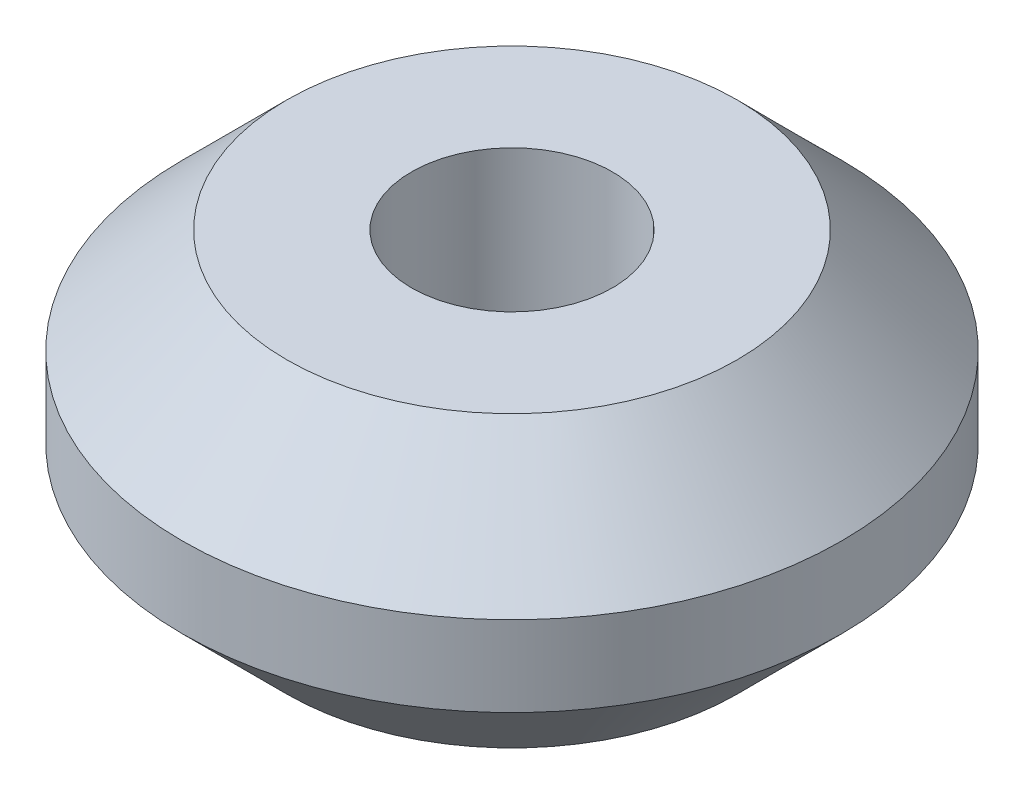
ISO-10303-21;
HEADER;
FILE_DESCRIPTION(('STEP AP214'),'2;1');
FILE_NAME('part.step','',(''),(''),'','','');
FILE_SCHEMA(('AUTOMOTIVE_DESIGN { 1 0 10303 214 1 1 1 1 }'));
ENDSEC;
DATA;
#1=APPLICATION_CONTEXT('core data for automotive mechanical design processes');
#2=APPLICATION_PROTOCOL_DEFINITION('international standard','automotive_design',2000,#1);
#3=PRODUCT_CONTEXT('',#1,'mechanical');
#4=PRODUCT('Part','Part','',(#3));
#5=PRODUCT_RELATED_PRODUCT_CATEGORY('part','',(#4));
#6=PRODUCT_DEFINITION_FORMATION('','',#4);
#7=PRODUCT_DEFINITION_CONTEXT('part definition',#1,'design');
#8=PRODUCT_DEFINITION('design','',#6,#7);
#9=PRODUCT_DEFINITION_SHAPE('','',#8);
#10=(LENGTH_UNIT() NAMED_UNIT(*) SI_UNIT(.MILLI.,.METRE.));
#11=(NAMED_UNIT(*) PLANE_ANGLE_UNIT() SI_UNIT($,.RADIAN.));
#12=(NAMED_UNIT(*) SI_UNIT($,.STERADIAN.) SOLID_ANGLE_UNIT());
#13=UNCERTAINTY_MEASURE_WITH_UNIT(LENGTH_MEASURE(1.E-05),#10,'distance_accuracy_value','');
#14=(GEOMETRIC_REPRESENTATION_CONTEXT(3) GLOBAL_UNCERTAINTY_ASSIGNED_CONTEXT((#13)) GLOBAL_UNIT_ASSIGNED_CONTEXT((#10,
#11,#12)) REPRESENTATION_CONTEXT('',''));
#15=CARTESIAN_POINT('',(0.,0.,0.));
#16=DIRECTION('',(0.,0.,1.));
#17=DIRECTION('',(1.,0.,0.));
#18=AXIS2_PLACEMENT_3D('',#15,#16,#17);
#19=CARTESIAN_POINT('',(0.,18.,0.));
#20=DIRECTION('',(0.,-1.,0.));
#21=DIRECTION('',(0.,0.,-1.));
#22=AXIS2_PLACEMENT_3D('',#19,#20,#21);
#23=CYLINDRICAL_SURFACE('',#22,20.5);
#24=CARTESIAN_POINT('',(0.,11.5,0.));
#25=DIRECTION('',(0.,1.,0.));
#26=DIRECTION('',(0.,0.,1.));
#27=AXIS2_PLACEMENT_3D('',#24,#25,#26);
#28=CIRCLE('',#27,20.5);
#29=CARTESIAN_POINT('',(0.,11.5,20.5));
#30=VERTEX_POINT('',#29);
#31=EDGE_CURVE('E47',#30,#30,#28,.F.);
#32=ORIENTED_EDGE('',*,*,#31,.T.);
#33=EDGE_LOOP('',(#32));
#34=FACE_BOUND('',#33,.T.);
#35=CARTESIAN_POINT('',(0.,6.5,0.));
#36=DIRECTION('',(0.,1.,0.));
#37=DIRECTION('',(0.,0.,1.));
#38=AXIS2_PLACEMENT_3D('',#35,#36,#37);
#39=CIRCLE('',#38,20.5);
#40=CARTESIAN_POINT('',(0.,6.5,20.5));
#41=VERTEX_POINT('',#40);
#42=EDGE_CURVE('E51',#41,#41,#39,.T.);
#43=ORIENTED_EDGE('',*,*,#42,.T.);
#44=EDGE_LOOP('',(#43));
#45=FACE_BOUND('',#44,.T.);
#46=ADVANCED_FACE('F39',(#34,#45),#23,.T.);
#47=CARTESIAN_POINT('',(0.,18.,0.));
#48=DIRECTION('',(0.,1.,0.));
#49=DIRECTION('',(0.,0.,1.));
#50=AXIS2_PLACEMENT_3D('',#47,#48,#49);
#51=PLANE('',#50);
#52=CARTESIAN_POINT('',(0.,18.,0.));
#53=DIRECTION('',(0.,1.,0.));
#54=DIRECTION('',(0.,0.,1.));
#55=AXIS2_PLACEMENT_3D('',#52,#53,#54);
#56=CIRCLE('',#55,6.25);
#57=CARTESIAN_POINT('',(0.,18.,6.25));
#58=VERTEX_POINT('',#57);
#59=EDGE_CURVE('E61',#58,#58,#56,.T.);
#60=ORIENTED_EDGE('',*,*,#59,.F.);
#61=EDGE_LOOP('',(#60));
#62=FACE_BOUND('',#61,.T.);
#63=CARTESIAN_POINT('',(0.,18.,0.));
#64=DIRECTION('',(0.,1.,0.));
#65=DIRECTION('',(0.,0.,1.));
#66=AXIS2_PLACEMENT_3D('',#63,#64,#65);
#67=CIRCLE('',#66,14.);
#68=CARTESIAN_POINT('',(0.,18.,14.));
#69=VERTEX_POINT('',#68);
#70=EDGE_CURVE('E55',#69,#69,#67,.T.);
#71=ORIENTED_EDGE('',*,*,#70,.T.);
#72=EDGE_LOOP('',(#71));
#73=FACE_BOUND('',#72,.T.);
#74=ADVANCED_FACE('F75',(#62,#73),#51,.T.);
#75=CARTESIAN_POINT('',(0.,0.,0.));
#76=DIRECTION('',(0.,1.,0.));
#77=DIRECTION('',(0.,0.,1.));
#78=AXIS2_PLACEMENT_3D('',#75,#76,#77);
#79=PLANE('',#78);
#80=CARTESIAN_POINT('',(0.,0.,0.));
#81=DIRECTION('',(0.,1.,0.));
#82=DIRECTION('',(0.,0.,1.));
#83=AXIS2_PLACEMENT_3D('',#80,#81,#82);
#84=CIRCLE('',#83,6.25);
#85=CARTESIAN_POINT('',(0.,0.,6.25));
#86=VERTEX_POINT('',#85);
#87=EDGE_CURVE('E60',#86,#86,#84,.T.);
#88=ORIENTED_EDGE('',*,*,#87,.T.);
#89=EDGE_LOOP('',(#88));
#90=FACE_BOUND('',#89,.T.);
#91=CARTESIAN_POINT('',(0.,0.,0.));
#92=DIRECTION('',(0.,1.,0.));
#93=DIRECTION('',(0.,0.,1.));
#94=AXIS2_PLACEMENT_3D('',#91,#92,#93);
#95=CIRCLE('',#94,14.);
#96=CARTESIAN_POINT('',(0.,0.,14.));
#97=VERTEX_POINT('',#96);
#98=EDGE_CURVE('E10',#97,#97,#95,.F.);
#99=ORIENTED_EDGE('',*,*,#98,.T.);
#100=EDGE_LOOP('',(#99));
#101=FACE_BOUND('',#100,.T.);
#102=ADVANCED_FACE('F67',(#90,#101),#79,.F.);
#103=CARTESIAN_POINT('',(0.,18.,0.));
#104=DIRECTION('',(0.,-1.,0.));
#105=DIRECTION('',(0.,0.,-1.));
#106=AXIS2_PLACEMENT_3D('',#103,#104,#105);
#107=CONICAL_SURFACE('',#106,14.,0.785398163397446);
#108=ORIENTED_EDGE('',*,*,#31,.F.);
#109=EDGE_LOOP('',(#108));
#110=FACE_BOUND('',#109,.T.);
#111=ORIENTED_EDGE('',*,*,#70,.F.);
#112=EDGE_LOOP('',(#111));
#113=FACE_BOUND('',#112,.T.);
#114=ADVANCED_FACE('F81',(#110,#113),#107,.T.);
#115=CARTESIAN_POINT('',(0.,6.5,0.));
#116=DIRECTION('',(0.,1.,0.));
#117=DIRECTION('',(0.,0.,1.));
#118=AXIS2_PLACEMENT_3D('',#115,#116,#117);
#119=CONICAL_SURFACE('',#118,20.5,0.785398163397449);
#120=CARTESIAN_POINT('',(0.,0.,14.));
#121=CARTESIAN_POINT('',(0.,0.0677083333333323,14.0677083333333));
#122=CARTESIAN_POINT('',(0.,0.135416666666666,14.1354166666666));
#123=CARTESIAN_POINT('',(0.,0.270833333333333,14.2708333333333));
#124=CARTESIAN_POINT('',(0.,0.338541666666666,14.3385416666667));
#125=CARTESIAN_POINT('',(0.,0.473958333333333,14.4739583333333));
#126=CARTESIAN_POINT('',(0.,0.541666666666666,14.5416666666667));
#127=CARTESIAN_POINT('',(0.,0.677083333333333,14.6770833333333));
#128=CARTESIAN_POINT('',(0.,0.744791666666666,14.7447916666667));
#129=CARTESIAN_POINT('',(0.,0.880208333333333,14.8802083333333));
#130=CARTESIAN_POINT('',(0.,0.947916666666667,14.9479166666667));
#131=CARTESIAN_POINT('',(0.,1.08333333333333,15.0833333333333));
#132=CARTESIAN_POINT('',(0.,1.15104166666667,15.1510416666667));
#133=CARTESIAN_POINT('',(0.,1.28645833333333,15.2864583333333));
#134=CARTESIAN_POINT('',(0.,1.35416666666667,15.3541666666667));
#135=CARTESIAN_POINT('',(0.,1.48958333333333,15.4895833333333));
#136=CARTESIAN_POINT('',(0.,1.55729166666667,15.5572916666667));
#137=CARTESIAN_POINT('',(0.,1.69270833333333,15.6927083333333));
#138=CARTESIAN_POINT('',(0.,1.76041666666667,15.7604166666667));
#139=CARTESIAN_POINT('',(0.,1.89583333333333,15.8958333333333));
#140=CARTESIAN_POINT('',(0.,1.96354166666667,15.9635416666667));
#141=CARTESIAN_POINT('',(0.,2.09895833333333,16.0989583333333));
#142=CARTESIAN_POINT('',(0.,2.16666666666667,16.1666666666667));
#143=CARTESIAN_POINT('',(0.,2.30208333333333,16.3020833333333));
#144=CARTESIAN_POINT('',(0.,2.36979166666667,16.3697916666667));
#145=CARTESIAN_POINT('',(0.,2.50520833333333,16.5052083333333));
#146=CARTESIAN_POINT('',(0.,2.57291666666667,16.5729166666667));
#147=CARTESIAN_POINT('',(0.,2.70833333333333,16.7083333333333));
#148=CARTESIAN_POINT('',(0.,2.77604166666667,16.7760416666667));
#149=CARTESIAN_POINT('',(0.,2.91145833333333,16.9114583333333));
#150=CARTESIAN_POINT('',(0.,2.97916666666667,16.9791666666667));
#151=CARTESIAN_POINT('',(0.,3.11458333333333,17.1145833333333));
#152=CARTESIAN_POINT('',(0.,3.18229166666667,17.1822916666667));
#153=CARTESIAN_POINT('',(0.,3.31770833333333,17.3177083333333));
#154=CARTESIAN_POINT('',(0.,3.38541666666667,17.3854166666667));
#155=CARTESIAN_POINT('',(0.,3.52083333333333,17.5208333333333));
#156=CARTESIAN_POINT('',(0.,3.58854166666667,17.5885416666667));
#157=CARTESIAN_POINT('',(0.,3.72395833333333,17.7239583333333));
#158=CARTESIAN_POINT('',(0.,3.79166666666667,17.7916666666667));
#159=CARTESIAN_POINT('',(0.,3.92708333333333,17.9270833333333));
#160=CARTESIAN_POINT('',(0.,3.99479166666667,17.9947916666667));
#161=CARTESIAN_POINT('',(0.,4.13020833333333,18.1302083333333));
#162=CARTESIAN_POINT('',(0.,4.19791666666667,18.1979166666667));
#163=CARTESIAN_POINT('',(0.,4.33333333333334,18.3333333333333));
#164=CARTESIAN_POINT('',(0.,4.40104166666667,18.4010416666667));
#165=CARTESIAN_POINT('',(0.,4.53645833333333,18.5364583333333));
#166=CARTESIAN_POINT('',(0.,4.60416666666667,18.6041666666667));
#167=CARTESIAN_POINT('',(0.,4.73958333333333,18.7395833333333));
#168=CARTESIAN_POINT('',(0.,4.80729166666667,18.8072916666667));
#169=CARTESIAN_POINT('',(0.,4.94270833333333,18.9427083333333));
#170=CARTESIAN_POINT('',(0.,5.01041666666667,19.0104166666667));
#171=CARTESIAN_POINT('',(0.,5.14583333333333,19.1458333333333));
#172=CARTESIAN_POINT('',(0.,5.21354166666667,19.2135416666667));
#173=CARTESIAN_POINT('',(0.,5.34895833333333,19.3489583333333));
#174=CARTESIAN_POINT('',(0.,5.41666666666667,19.4166666666667));
#175=CARTESIAN_POINT('',(0.,5.55208333333333,19.5520833333333));
#176=CARTESIAN_POINT('',(0.,5.61979166666667,19.6197916666667));
#177=CARTESIAN_POINT('',(0.,5.75520833333334,19.7552083333333));
#178=CARTESIAN_POINT('',(0.,5.82291666666667,19.8229166666667));
#179=CARTESIAN_POINT('',(0.,5.95833333333333,19.9583333333333));
#180=CARTESIAN_POINT('',(0.,6.02604166666667,20.0260416666667));
#181=CARTESIAN_POINT('',(0.,6.16145833333333,20.1614583333333));
#182=CARTESIAN_POINT('',(0.,6.22916666666667,20.2291666666667));
#183=CARTESIAN_POINT('',(0.,6.36458333333334,20.3645833333333));
#184=CARTESIAN_POINT('',(0.,6.43229166666667,20.4322916666667));
#185=CARTESIAN_POINT('',(0.,6.5,20.5));
#186=B_SPLINE_CURVE_WITH_KNOTS('',3,(#120,#121,#122,#123,#124,#125,#126,#127,#128,#129,#130,
#131,#132,#133,#134,#135,#136,#137,#138,#139,#140,#141,#142,#143,#144,#145,#146,#147,#148,#149,
#150,#151,#152,#153,#154,#155,#156,#157,#158,#159,#160,#161,#162,#163,#164,#165,#166,#167,#168,
#169,#170,#171,#172,#173,#174,#175,#176,#177,#178,#179,#180,#181,#182,#183,#184,#185),
.UNSPECIFIED.,.F.,.F.,(4,2,2,2,2,2,2,2,2,2,2,2,2,2,2,2,2,2,2,2,2,2,2,2,2,2,2,2,2,2,2,2,4),(0.,
0.287262129857036,0.574524259714072,0.861786389571107,1.14904851942814,1.43631064928518,
1.72357277914221,2.01083490899925,2.29809703885629,2.58535916871332,2.87262129857036,
3.15988342842739,3.44714555828443,3.73440768814146,4.0216698179985,4.30893194785553,
4.59619407771257,4.8834562075696,5.17071833742664,5.45798046728367,5.74524259714071,
6.03250472699774,6.31976685685478,6.60702898671182,6.89429111656885,7.18155324642589,
7.46881537628292,7.75607750613996,8.04333963599699,8.33060176585403,8.61786389571106,
8.9051260255681,9.19238815542514),.UNSPECIFIED.);
#187=EDGE_CURVE('BSEAM42',#97,#41,#186,.T.);
#188=ORIENTED_EDGE('',*,*,#98,.F.);
#189=ORIENTED_EDGE('',*,*,#42,.F.);
#190=ORIENTED_EDGE('',*,*,#187,.T.);
#191=ORIENTED_EDGE('',*,*,#187,.F.);
#192=EDGE_LOOP('',(#188,#190,#189,#191));
#193=FACE_BOUND('',#192,.T.);
#194=ADVANCED_FACE('F42',(#193),#119,.T.);
#195=CARTESIAN_POINT('',(0.,0.,0.));
#196=DIRECTION('',(0.,1.,0.));
#197=DIRECTION('',(0.,0.,1.));
#198=AXIS2_PLACEMENT_3D('',#195,#196,#197);
#199=CYLINDRICAL_SURFACE('',#198,6.25);
#200=ORIENTED_EDGE('',*,*,#87,.F.);
#201=EDGE_LOOP('',(#200));
#202=FACE_BOUND('',#201,.T.);
#203=ORIENTED_EDGE('',*,*,#59,.T.);
#204=EDGE_LOOP('',(#203));
#205=FACE_BOUND('',#204,.T.);
#206=ADVANCED_FACE('F69',(#202,#205),#199,.F.);
#207=CLOSED_SHELL('',(#46,#74,#102,#114,#194,#206));
#208=MANIFOLD_SOLID_BREP('B2',#207);
#209=ADVANCED_BREP_SHAPE_REPRESENTATION('',(#18,#208),#14);
#210=SHAPE_DEFINITION_REPRESENTATION(#9,#209);
ENDSEC;
END-ISO-10303-21;
